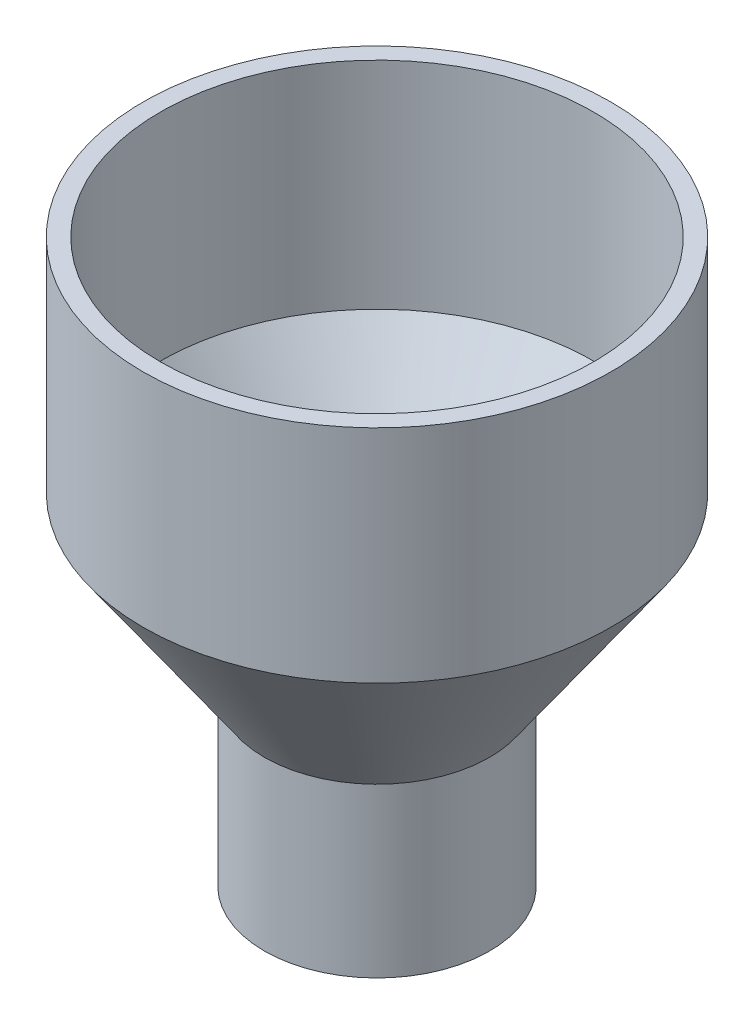
ISO-10303-21;
HEADER;
FILE_DESCRIPTION(('STEP AP214'),'2;1');
FILE_NAME('part.step','',(''),(''),'','','');
FILE_SCHEMA(('AUTOMOTIVE_DESIGN { 1 0 10303 214 1 1 1 1 }'));
ENDSEC;
DATA;
#1=APPLICATION_CONTEXT('core data for automotive mechanical design processes');
#2=APPLICATION_PROTOCOL_DEFINITION('international standard','automotive_design',2000,#1);
#3=PRODUCT_CONTEXT('',#1,'mechanical');
#4=PRODUCT('Part','Part','',(#3));
#5=PRODUCT_RELATED_PRODUCT_CATEGORY('part','',(#4));
#6=PRODUCT_DEFINITION_FORMATION('','',#4);
#7=PRODUCT_DEFINITION_CONTEXT('part definition',#1,'design');
#8=PRODUCT_DEFINITION('design','',#6,#7);
#9=PRODUCT_DEFINITION_SHAPE('','',#8);
#10=(LENGTH_UNIT() NAMED_UNIT(*) SI_UNIT(.MILLI.,.METRE.));
#11=(NAMED_UNIT(*) PLANE_ANGLE_UNIT() SI_UNIT($,.RADIAN.));
#12=(NAMED_UNIT(*) SI_UNIT($,.STERADIAN.) SOLID_ANGLE_UNIT());
#13=UNCERTAINTY_MEASURE_WITH_UNIT(LENGTH_MEASURE(1.E-05),#10,'distance_accuracy_value','');
#14=(GEOMETRIC_REPRESENTATION_CONTEXT(3) GLOBAL_UNCERTAINTY_ASSIGNED_CONTEXT((#13)) GLOBAL_UNIT_ASSIGNED_CONTEXT((#10,
#11,#12)) REPRESENTATION_CONTEXT('',''));
#15=CARTESIAN_POINT('',(0.,0.,0.));
#16=DIRECTION('',(0.,0.,1.));
#17=DIRECTION('',(1.,0.,0.));
#18=AXIS2_PLACEMENT_3D('',#15,#16,#17);
#19=CARTESIAN_POINT('',(0.,0.,0.));
#20=DIRECTION('',(0.,1.,0.));
#21=DIRECTION('',(0.,0.,1.));
#22=AXIS2_PLACEMENT_3D('',#19,#20,#21);
#23=PLANE('',#22);
#24=CARTESIAN_POINT('',(0.,0.,0.));
#25=DIRECTION('',(0.,1.,0.));
#26=DIRECTION('',(0.,0.,1.));
#27=AXIS2_PLACEMENT_3D('',#24,#25,#26);
#28=CIRCLE('',#27,13.);
#29=CARTESIAN_POINT('',(0.,0.,13.));
#30=VERTEX_POINT('',#29);
#31=EDGE_CURVE('E62',#30,#30,#28,.T.);
#32=ORIENTED_EDGE('',*,*,#31,.F.);
#33=EDGE_LOOP('',(#32));
#34=FACE_BOUND('',#33,.T.);
#35=CARTESIAN_POINT('',(0.,0.,0.));
#36=DIRECTION('',(0.,1.,0.));
#37=DIRECTION('',(0.,0.,1.));
#38=AXIS2_PLACEMENT_3D('',#35,#36,#37);
#39=CIRCLE('',#38,11.);
#40=CARTESIAN_POINT('',(0.,0.,11.));
#41=VERTEX_POINT('',#40);
#42=EDGE_CURVE('E10',#41,#41,#39,.T.);
#43=ORIENTED_EDGE('',*,*,#42,.T.);
#44=EDGE_LOOP('',(#43));
#45=FACE_BOUND('',#44,.T.);
#46=ADVANCED_FACE('F34',(#34,#45),#23,.F.);
#47=CARTESIAN_POINT('',(0.,64.9051279390045,0.));
#48=DIRECTION('',(0.,1.,0.));
#49=DIRECTION('',(0.,0.,1.));
#50=AXIS2_PLACEMENT_3D('',#47,#48,#49);
#51=CYLINDRICAL_SURFACE('',#50,11.);
#52=CARTESIAN_POINT('',(0.,20.,0.));
#53=DIRECTION('',(0.,1.,0.));
#54=DIRECTION('',(0.,0.,1.));
#55=AXIS2_PLACEMENT_3D('',#52,#53,#54);
#56=CIRCLE('',#55,11.);
#57=CARTESIAN_POINT('',(0.,20.,11.));
#58=VERTEX_POINT('',#57);
#59=EDGE_CURVE('E40',#58,#58,#56,.T.);
#60=ORIENTED_EDGE('',*,*,#59,.T.);
#61=EDGE_LOOP('',(#60));
#62=FACE_BOUND('',#61,.T.);
#63=ORIENTED_EDGE('',*,*,#42,.F.);
#64=EDGE_LOOP('',(#63));
#65=FACE_BOUND('',#64,.T.);
#66=ADVANCED_FACE('F69',(#62,#65),#51,.F.);
#67=CARTESIAN_POINT('',(0.,40.,0.));
#68=DIRECTION('',(0.,1.,0.));
#69=DIRECTION('',(0.,0.,1.));
#70=AXIS2_PLACEMENT_3D('',#67,#68,#69);
#71=CONICAL_SURFACE('',#70,25.,0.610725964389209);
#72=ORIENTED_EDGE('',*,*,#59,.F.);
#73=EDGE_LOOP('',(#72));
#74=FACE_BOUND('',#73,.T.);
#75=CARTESIAN_POINT('',(0.,40.,0.));
#76=DIRECTION('',(0.,1.,0.));
#77=DIRECTION('',(0.,0.,1.));
#78=AXIS2_PLACEMENT_3D('',#75,#76,#77);
#79=CIRCLE('',#78,25.);
#80=CARTESIAN_POINT('',(0.,40.,25.));
#81=VERTEX_POINT('',#80);
#82=EDGE_CURVE('E44',#81,#81,#79,.T.);
#83=ORIENTED_EDGE('',*,*,#82,.T.);
#84=EDGE_LOOP('',(#83));
#85=FACE_BOUND('',#84,.T.);
#86=ADVANCED_FACE('F73',(#74,#85),#71,.F.);
#87=CARTESIAN_POINT('',(0.,64.9051279390045,0.));
#88=DIRECTION('',(0.,1.,0.));
#89=DIRECTION('',(0.,0.,1.));
#90=AXIS2_PLACEMENT_3D('',#87,#88,#89);
#91=CYLINDRICAL_SURFACE('',#90,25.);
#92=CARTESIAN_POINT('',(0.,64.9051279390045,0.));
#93=DIRECTION('',(0.,1.,0.));
#94=DIRECTION('',(0.,0.,1.));
#95=AXIS2_PLACEMENT_3D('',#92,#93,#94);
#96=CIRCLE('',#95,25.);
#97=CARTESIAN_POINT('',(0.,64.9051279390045,25.));
#98=VERTEX_POINT('',#97);
#99=EDGE_CURVE('E48',#98,#98,#96,.T.);
#100=ORIENTED_EDGE('',*,*,#99,.T.);
#101=EDGE_LOOP('',(#100));
#102=FACE_BOUND('',#101,.T.);
#103=ORIENTED_EDGE('',*,*,#82,.F.);
#104=EDGE_LOOP('',(#103));
#105=FACE_BOUND('',#104,.T.);
#106=ADVANCED_FACE('F77',(#102,#105),#91,.F.);
#107=CARTESIAN_POINT('',(0.,64.9051279390045,0.));
#108=DIRECTION('',(0.,-1.,0.));
#109=DIRECTION('',(0.,0.,-1.));
#110=AXIS2_PLACEMENT_3D('',#107,#108,#109);
#111=PLANE('',#110);
#112=ORIENTED_EDGE('',*,*,#99,.F.);
#113=EDGE_LOOP('',(#112));
#114=FACE_BOUND('',#113,.T.);
#115=CARTESIAN_POINT('',(0.,64.9051279390045,0.));
#116=DIRECTION('',(0.,1.,0.));
#117=DIRECTION('',(0.,0.,1.));
#118=AXIS2_PLACEMENT_3D('',#115,#116,#117);
#119=CIRCLE('',#118,27.);
#120=CARTESIAN_POINT('',(0.,64.9051279390045,27.));
#121=VERTEX_POINT('',#120);
#122=EDGE_CURVE('E53',#121,#121,#119,.T.);
#123=ORIENTED_EDGE('',*,*,#122,.T.);
#124=EDGE_LOOP('',(#123));
#125=FACE_BOUND('',#124,.T.);
#126=ADVANCED_FACE('F84',(#114,#125),#111,.F.);
#127=CARTESIAN_POINT('',(0.,64.9051279390045,0.));
#128=DIRECTION('',(0.,1.,0.));
#129=DIRECTION('',(0.,0.,1.));
#130=AXIS2_PLACEMENT_3D('',#127,#128,#129);
#131=CYLINDRICAL_SURFACE('',#130,27.);
#132=ORIENTED_EDGE('',*,*,#122,.F.);
#133=EDGE_LOOP('',(#132));
#134=FACE_BOUND('',#133,.T.);
#135=CARTESIAN_POINT('',(0.,39.3695555383618,0.));
#136=DIRECTION('',(0.,1.,0.));
#137=DIRECTION('',(0.,0.,1.));
#138=AXIS2_PLACEMENT_3D('',#135,#136,#137);
#139=CIRCLE('',#138,27.);
#140=CARTESIAN_POINT('',(0.,39.3695555383618,27.));
#141=VERTEX_POINT('',#140);
#142=EDGE_CURVE('E56',#141,#141,#139,.T.);
#143=ORIENTED_EDGE('',*,*,#142,.T.);
#144=EDGE_LOOP('',(#143));
#145=FACE_BOUND('',#144,.T.);
#146=ADVANCED_FACE('F88',(#134,#145),#131,.T.);
#147=CARTESIAN_POINT('',(0.,39.3695555383618,0.));
#148=DIRECTION('',(0.,1.,0.));
#149=DIRECTION('',(0.,0.,1.));
#150=AXIS2_PLACEMENT_3D('',#147,#148,#149);
#151=CONICAL_SURFACE('',#150,27.,0.610725964389209);
#152=CARTESIAN_POINT('',(0.,19.3695555383618,0.));
#153=DIRECTION('',(0.,1.,0.));
#154=DIRECTION('',(0.,0.,1.));
#155=AXIS2_PLACEMENT_3D('',#152,#153,#154);
#156=CIRCLE('',#155,13.);
#157=CARTESIAN_POINT('',(0.,19.3695555383618,13.));
#158=VERTEX_POINT('',#157);
#159=EDGE_CURVE('E59',#158,#158,#156,.T.);
#160=ORIENTED_EDGE('',*,*,#159,.T.);
#161=EDGE_LOOP('',(#160));
#162=FACE_BOUND('',#161,.T.);
#163=ORIENTED_EDGE('',*,*,#142,.F.);
#164=EDGE_LOOP('',(#163));
#165=FACE_BOUND('',#164,.T.);
#166=ADVANCED_FACE('F92',(#162,#165),#151,.T.);
#167=CARTESIAN_POINT('',(0.,64.9051279390045,0.));
#168=DIRECTION('',(0.,1.,0.));
#169=DIRECTION('',(0.,0.,1.));
#170=AXIS2_PLACEMENT_3D('',#167,#168,#169);
#171=CYLINDRICAL_SURFACE('',#170,13.);
#172=ORIENTED_EDGE('',*,*,#159,.F.);
#173=EDGE_LOOP('',(#172));
#174=FACE_BOUND('',#173,.T.);
#175=ORIENTED_EDGE('',*,*,#31,.T.);
#176=EDGE_LOOP('',(#175));
#177=FACE_BOUND('',#176,.T.);
#178=ADVANCED_FACE('F66',(#174,#177),#171,.T.);
#179=CLOSED_SHELL('',(#46,#66,#86,#106,#126,#146,#166,#178));
#180=MANIFOLD_SOLID_BREP('B2',#179);
#181=ADVANCED_BREP_SHAPE_REPRESENTATION('',(#18,#180),#14);
#182=SHAPE_DEFINITION_REPRESENTATION(#9,#181);
ENDSEC;
END-ISO-10303-21;
